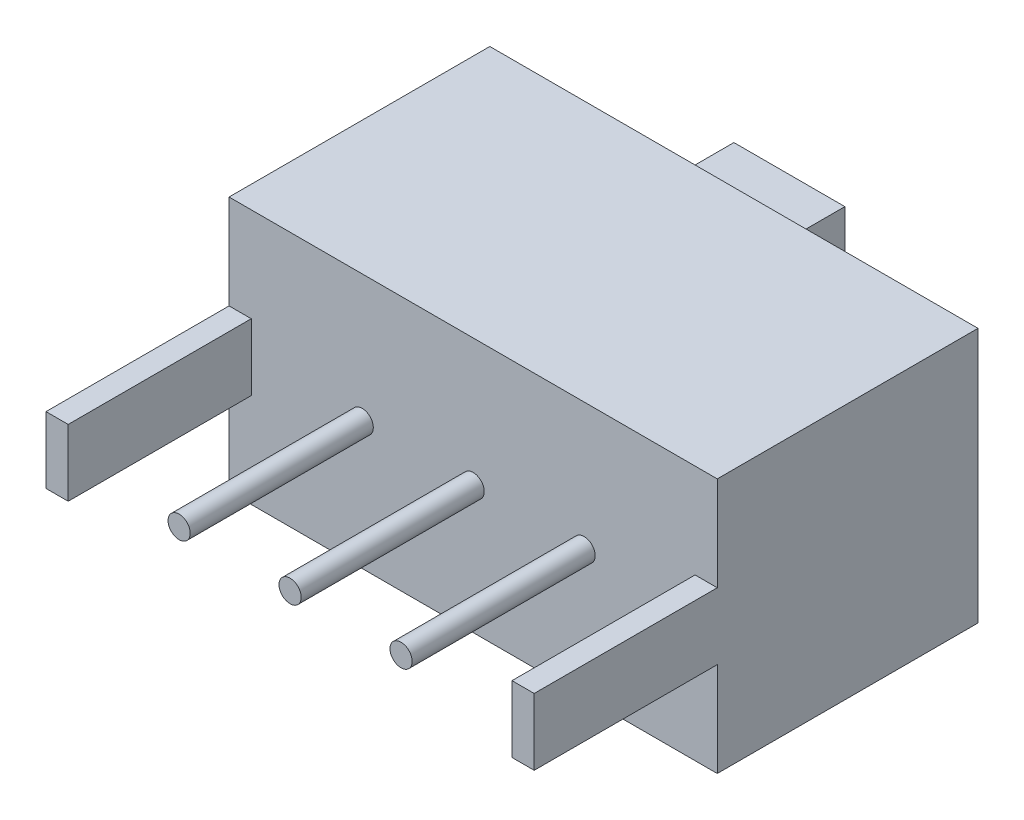
ISO-10303-21;
HEADER;
FILE_DESCRIPTION(('STEP AP214'),'2;1');
FILE_NAME('part.step','',(''),(''),'','','');
FILE_SCHEMA(('AUTOMOTIVE_DESIGN { 1 0 10303 214 1 1 1 1 }'));
ENDSEC;
DATA;
#1=APPLICATION_CONTEXT('core data for automotive mechanical design processes');
#2=APPLICATION_PROTOCOL_DEFINITION('international standard','automotive_design',2000,#1);
#3=PRODUCT_CONTEXT('',#1,'mechanical');
#4=PRODUCT('Part','Part','',(#3));
#5=PRODUCT_RELATED_PRODUCT_CATEGORY('part','',(#4));
#6=PRODUCT_DEFINITION_FORMATION('','',#4);
#7=PRODUCT_DEFINITION_CONTEXT('part definition',#1,'design');
#8=PRODUCT_DEFINITION('design','',#6,#7);
#9=PRODUCT_DEFINITION_SHAPE('','',#8);
#10=(LENGTH_UNIT() NAMED_UNIT(*) SI_UNIT(.MILLI.,.METRE.));
#11=(NAMED_UNIT(*) PLANE_ANGLE_UNIT() SI_UNIT($,.RADIAN.));
#12=(NAMED_UNIT(*) SI_UNIT($,.STERADIAN.) SOLID_ANGLE_UNIT());
#13=UNCERTAINTY_MEASURE_WITH_UNIT(LENGTH_MEASURE(1.E-05),#10,'distance_accuracy_value','');
#14=(GEOMETRIC_REPRESENTATION_CONTEXT(3) GLOBAL_UNCERTAINTY_ASSIGNED_CONTEXT((#13)) GLOBAL_UNIT_ASSIGNED_CONTEXT((#10,
#11,#12)) REPRESENTATION_CONTEXT('',''));
#15=CARTESIAN_POINT('',(0.,0.,0.));
#16=DIRECTION('',(0.,0.,1.));
#17=DIRECTION('',(1.,0.,0.));
#18=AXIS2_PLACEMENT_3D('',#15,#16,#17);
#19=CARTESIAN_POINT('',(0.,0.,4.7));
#20=DIRECTION('',(0.,0.,-1.));
#21=DIRECTION('',(-1.,0.,0.));
#22=AXIS2_PLACEMENT_3D('',#19,#20,#21);
#23=PLANE('',#22);
#24=CARTESIAN_POINT('',(2.4,-2.3,4.7));
#25=DIRECTION('',(0.,0.,-1.));
#26=DIRECTION('',(-1.,0.,0.));
#27=AXIS2_PLACEMENT_3D('',#24,#25,#26);
#28=CIRCLE('',#27,0.2);
#29=CARTESIAN_POINT('',(2.2,-2.3,4.7));
#30=VERTEX_POINT('',#29);
#31=EDGE_CURVE('E246',#30,#30,#28,.F.);
#32=ORIENTED_EDGE('',*,*,#31,.F.);
#33=EDGE_LOOP('',(#32));
#34=FACE_BOUND('',#33,.T.);
#35=CARTESIAN_POINT('',(4.4,-2.3,4.7));
#36=DIRECTION('',(0.,0.,-1.));
#37=DIRECTION('',(-1.,0.,0.));
#38=AXIS2_PLACEMENT_3D('',#35,#36,#37);
#39=CIRCLE('',#38,0.2);
#40=CARTESIAN_POINT('',(4.2,-2.3,4.7));
#41=VERTEX_POINT('',#40);
#42=EDGE_CURVE('E68',#41,#41,#39,.F.);
#43=ORIENTED_EDGE('',*,*,#42,.F.);
#44=EDGE_LOOP('',(#43));
#45=FACE_BOUND('',#44,.T.);
#46=CARTESIAN_POINT('',(6.4,-2.3,4.7));
#47=DIRECTION('',(0.,0.,-1.));
#48=DIRECTION('',(-1.,0.,0.));
#49=AXIS2_PLACEMENT_3D('',#46,#47,#48);
#50=CIRCLE('',#49,0.2);
#51=CARTESIAN_POINT('',(6.2,-2.3,4.7));
#52=VERTEX_POINT('',#51);
#53=EDGE_CURVE('E12',#52,#52,#50,.F.);
#54=ORIENTED_EDGE('',*,*,#53,.F.);
#55=EDGE_LOOP('',(#54));
#56=FACE_BOUND('',#55,.T.);
#57=DIRECTION('',(-1.,0.,0.));
#58=VECTOR('',#57,1.);
#59=CARTESIAN_POINT('',(8.8,-1.7,4.7));
#60=LINE('',#59,#58);
#61=CARTESIAN_POINT('',(8.8,-1.7,4.7));
#62=VERTEX_POINT('',#61);
#63=CARTESIAN_POINT('',(8.4,-1.7,4.7));
#64=VERTEX_POINT('',#63);
#65=EDGE_CURVE('E202',#62,#64,#60,.T.);
#66=ORIENTED_EDGE('',*,*,#65,.F.);
#67=DIRECTION('',(0.,-1.,0.));
#68=VECTOR('',#67,1.);
#69=CARTESIAN_POINT('',(8.8,0.,4.7));
#70=LINE('',#69,#68);
#71=CARTESIAN_POINT('',(8.8,0.,4.7));
#72=VERTEX_POINT('',#71);
#73=EDGE_CURVE('E212',#72,#62,#70,.T.);
#74=ORIENTED_EDGE('',*,*,#73,.F.);
#75=DIRECTION('',(1.,0.,0.));
#76=VECTOR('',#75,1.);
#77=CARTESIAN_POINT('',(0.,0.,4.7));
#78=LINE('',#77,#76);
#79=CARTESIAN_POINT('',(0.,0.,4.7));
#80=VERTEX_POINT('',#79);
#81=EDGE_CURVE('E226',#80,#72,#78,.T.);
#82=ORIENTED_EDGE('',*,*,#81,.F.);
#83=DIRECTION('',(0.,-1.,0.));
#84=VECTOR('',#83,1.);
#85=CARTESIAN_POINT('',(0.,0.,4.7));
#86=LINE('',#85,#84);
#87=CARTESIAN_POINT('',(0.,-1.7,4.7));
#88=VERTEX_POINT('',#87);
#89=EDGE_CURVE('E230',#80,#88,#86,.T.);
#90=ORIENTED_EDGE('',*,*,#89,.T.);
#91=DIRECTION('',(1.,0.,0.));
#92=VECTOR('',#91,1.);
#93=CARTESIAN_POINT('',(0.,-1.7,4.7));
#94=LINE('',#93,#92);
#95=CARTESIAN_POINT('',(0.4,-1.7,4.7));
#96=VERTEX_POINT('',#95);
#97=EDGE_CURVE('E83',#88,#96,#94,.T.);
#98=ORIENTED_EDGE('',*,*,#97,.T.);
#99=DIRECTION('',(0.,-1.,0.));
#100=VECTOR('',#99,1.);
#101=CARTESIAN_POINT('',(0.4,-1.7,4.7));
#102=LINE('',#101,#100);
#103=CARTESIAN_POINT('',(0.4,-2.9,4.7));
#104=VERTEX_POINT('',#103);
#105=EDGE_CURVE('E523',#96,#104,#102,.T.);
#106=ORIENTED_EDGE('',*,*,#105,.T.);
#107=DIRECTION('',(1.,0.,0.));
#108=VECTOR('',#107,1.);
#109=CARTESIAN_POINT('',(0.,-2.9,4.7));
#110=LINE('',#109,#108);
#111=CARTESIAN_POINT('',(0.,-2.9,4.7));
#112=VERTEX_POINT('',#111);
#113=EDGE_CURVE('E508',#112,#104,#110,.T.);
#114=ORIENTED_EDGE('',*,*,#113,.F.);
#115=CARTESIAN_POINT('',(0.,-4.6,4.7));
#116=VERTEX_POINT('',#115);
#117=EDGE_CURVE('E224',#112,#116,#86,.T.);
#118=ORIENTED_EDGE('',*,*,#117,.T.);
#119=DIRECTION('',(1.,0.,0.));
#120=VECTOR('',#119,1.);
#121=CARTESIAN_POINT('',(0.,-4.6,4.7));
#122=LINE('',#121,#120);
#123=CARTESIAN_POINT('',(8.8,-4.6,4.7));
#124=VERTEX_POINT('',#123);
#125=EDGE_CURVE('E220',#116,#124,#122,.T.);
#126=ORIENTED_EDGE('',*,*,#125,.T.);
#127=CARTESIAN_POINT('',(8.8,-2.9,4.7));
#128=VERTEX_POINT('',#127);
#129=EDGE_CURVE('E221',#128,#124,#70,.T.);
#130=ORIENTED_EDGE('',*,*,#129,.F.);
#131=DIRECTION('',(-1.,0.,0.));
#132=VECTOR('',#131,1.);
#133=CARTESIAN_POINT('',(8.8,-2.9,4.7));
#134=LINE('',#133,#132);
#135=CARTESIAN_POINT('',(8.4,-2.9,4.7));
#136=VERTEX_POINT('',#135);
#137=EDGE_CURVE('E502',#128,#136,#134,.T.);
#138=ORIENTED_EDGE('',*,*,#137,.T.);
#139=DIRECTION('',(0.,-1.,0.));
#140=VECTOR('',#139,1.);
#141=CARTESIAN_POINT('',(8.4,-1.7,4.7));
#142=LINE('',#141,#140);
#143=EDGE_CURVE('E75',#64,#136,#142,.T.);
#144=ORIENTED_EDGE('',*,*,#143,.F.);
#145=EDGE_LOOP('',(#66,#74,#82,#90,#98,#106,#114,#118,#126,#130,#138,#144));
#146=FACE_BOUND('',#145,.T.);
#147=ADVANCED_FACE('F60',(#34,#45,#56,#146),#23,.F.);
#148=CARTESIAN_POINT('',(0.,0.,0.));
#149=DIRECTION('',(0.,0.,-1.));
#150=DIRECTION('',(-1.,0.,0.));
#151=AXIS2_PLACEMENT_3D('',#148,#149,#150);
#152=PLANE('',#151);
#153=DIRECTION('',(1.,0.,0.));
#154=VECTOR('',#153,1.);
#155=CARTESIAN_POINT('',(0.,0.,0.));
#156=LINE('',#155,#154);
#157=CARTESIAN_POINT('',(0.,0.,0.));
#158=VERTEX_POINT('',#157);
#159=CARTESIAN_POINT('',(8.8,0.,0.));
#160=VERTEX_POINT('',#159);
#161=EDGE_CURVE('E232',#158,#160,#156,.T.);
#162=ORIENTED_EDGE('',*,*,#161,.T.);
#163=DIRECTION('',(0.,-1.,0.));
#164=VECTOR('',#163,1.);
#165=CARTESIAN_POINT('',(8.8,0.,0.));
#166=LINE('',#165,#164);
#167=CARTESIAN_POINT('',(8.8,-4.6,0.));
#168=VERTEX_POINT('',#167);
#169=EDGE_CURVE('E235',#160,#168,#166,.T.);
#170=ORIENTED_EDGE('',*,*,#169,.T.);
#171=DIRECTION('',(1.,0.,0.));
#172=VECTOR('',#171,1.);
#173=CARTESIAN_POINT('',(0.,-4.6,0.));
#174=LINE('',#173,#172);
#175=CARTESIAN_POINT('',(0.,-4.6,0.));
#176=VERTEX_POINT('',#175);
#177=EDGE_CURVE('E239',#176,#168,#174,.T.);
#178=ORIENTED_EDGE('',*,*,#177,.F.);
#179=DIRECTION('',(0.,-1.,0.));
#180=VECTOR('',#179,1.);
#181=CARTESIAN_POINT('',(0.,0.,0.));
#182=LINE('',#181,#180);
#183=EDGE_CURVE('E242',#158,#176,#182,.T.);
#184=ORIENTED_EDGE('',*,*,#183,.F.);
#185=EDGE_LOOP('',(#162,#170,#178,#184));
#186=FACE_BOUND('',#185,.T.);
#187=DIRECTION('',(1.,0.,0.));
#188=VECTOR('',#187,1.);
#189=CARTESIAN_POINT('',(2.3,-1.2,0.));
#190=LINE('',#189,#188);
#191=CARTESIAN_POINT('',(2.3,-1.2,0.));
#192=VERTEX_POINT('',#191);
#193=CARTESIAN_POINT('',(6.5,-1.2,0.));
#194=VERTEX_POINT('',#193);
#195=EDGE_CURVE('E572',#192,#194,#190,.T.);
#196=ORIENTED_EDGE('',*,*,#195,.F.);
#197=DIRECTION('',(0.,-1.,0.));
#198=VECTOR('',#197,1.);
#199=CARTESIAN_POINT('',(2.3,-1.2,0.));
#200=LINE('',#199,#198);
#201=CARTESIAN_POINT('',(2.3,-3.4,0.));
#202=VERTEX_POINT('',#201);
#203=EDGE_CURVE('E562',#192,#202,#200,.T.);
#204=ORIENTED_EDGE('',*,*,#203,.T.);
#205=DIRECTION('',(1.,0.,0.));
#206=VECTOR('',#205,1.);
#207=CARTESIAN_POINT('',(2.3,-3.4,0.));
#208=LINE('',#207,#206);
#209=CARTESIAN_POINT('',(6.5,-3.4,0.));
#210=VERTEX_POINT('',#209);
#211=EDGE_CURVE('E583',#202,#210,#208,.T.);
#212=ORIENTED_EDGE('',*,*,#211,.T.);
#213=DIRECTION('',(0.,-1.,0.));
#214=VECTOR('',#213,1.);
#215=CARTESIAN_POINT('',(6.5,-1.2,0.));
#216=LINE('',#215,#214);
#217=EDGE_CURVE('E586',#194,#210,#216,.T.);
#218=ORIENTED_EDGE('',*,*,#217,.F.);
#219=EDGE_LOOP('',(#196,#204,#212,#218));
#220=FACE_BOUND('',#219,.T.);
#221=ADVANCED_FACE('F261',(#186,#220),#152,.T.);
#222=CARTESIAN_POINT('',(0.,0.,4.7));
#223=DIRECTION('',(0.,1.,0.));
#224=DIRECTION('',(0.,0.,1.));
#225=AXIS2_PLACEMENT_3D('',#222,#223,#224);
#226=PLANE('',#225);
#227=ORIENTED_EDGE('',*,*,#161,.F.);
#228=DIRECTION('',(0.,0.,-1.));
#229=VECTOR('',#228,1.);
#230=CARTESIAN_POINT('',(0.,0.,4.7));
#231=LINE('',#230,#229);
#232=EDGE_CURVE('E244',#80,#158,#231,.T.);
#233=ORIENTED_EDGE('',*,*,#232,.F.);
#234=ORIENTED_EDGE('',*,*,#81,.T.);
#235=DIRECTION('',(0.,0.,-1.));
#236=VECTOR('',#235,1.);
#237=CARTESIAN_POINT('',(8.8,0.,4.7));
#238=LINE('',#237,#236);
#239=EDGE_CURVE('E219',#72,#160,#238,.T.);
#240=ORIENTED_EDGE('',*,*,#239,.T.);
#241=EDGE_LOOP('',(#227,#233,#234,#240));
#242=FACE_BOUND('',#241,.T.);
#243=ADVANCED_FACE('F62',(#242),#226,.T.);
#244=CARTESIAN_POINT('',(0.,0.,4.7));
#245=DIRECTION('',(1.,0.,0.));
#246=DIRECTION('',(0.,1.,0.));
#247=AXIS2_PLACEMENT_3D('',#244,#245,#246);
#248=PLANE('',#247);
#249=ORIENTED_EDGE('',*,*,#183,.T.);
#250=DIRECTION('',(0.,0.,-1.));
#251=VECTOR('',#250,1.);
#252=CARTESIAN_POINT('',(0.,-4.6,4.7));
#253=LINE('',#252,#251);
#254=EDGE_CURVE('E247',#116,#176,#253,.T.);
#255=ORIENTED_EDGE('',*,*,#254,.F.);
#256=ORIENTED_EDGE('',*,*,#117,.F.);
#257=DIRECTION('',(0.,0.,-1.));
#258=VECTOR('',#257,1.);
#259=CARTESIAN_POINT('',(0.,-2.9,8.));
#260=LINE('',#259,#258);
#261=CARTESIAN_POINT('',(0.,-2.9,8.));
#262=VERTEX_POINT('',#261);
#263=EDGE_CURVE('E533',#262,#112,#260,.T.);
#264=ORIENTED_EDGE('',*,*,#263,.F.);
#265=DIRECTION('',(0.,-1.,0.));
#266=VECTOR('',#265,1.);
#267=CARTESIAN_POINT('',(0.,-1.7,8.));
#268=LINE('',#267,#266);
#269=CARTESIAN_POINT('',(0.,-1.7,8.));
#270=VERTEX_POINT('',#269);
#271=EDGE_CURVE('E509',#270,#262,#268,.T.);
#272=ORIENTED_EDGE('',*,*,#271,.F.);
#273=DIRECTION('',(0.,0.,-1.));
#274=VECTOR('',#273,1.);
#275=CARTESIAN_POINT('',(0.,-1.7,8.));
#276=LINE('',#275,#274);
#277=EDGE_CURVE('E520',#270,#88,#276,.T.);
#278=ORIENTED_EDGE('',*,*,#277,.T.);
#279=ORIENTED_EDGE('',*,*,#89,.F.);
#280=ORIENTED_EDGE('',*,*,#232,.T.);
#281=EDGE_LOOP('',(#249,#255,#256,#264,#272,#278,#279,#280));
#282=FACE_BOUND('',#281,.T.);
#283=ADVANCED_FACE('F355',(#282),#248,.F.);
#284=CARTESIAN_POINT('',(0.,-4.6,4.7));
#285=DIRECTION('',(0.,1.,0.));
#286=DIRECTION('',(0.,0.,1.));
#287=AXIS2_PLACEMENT_3D('',#284,#285,#286);
#288=PLANE('',#287);
#289=ORIENTED_EDGE('',*,*,#177,.T.);
#290=DIRECTION('',(0.,0.,-1.));
#291=VECTOR('',#290,1.);
#292=CARTESIAN_POINT('',(8.8,-4.6,4.7));
#293=LINE('',#292,#291);
#294=EDGE_CURVE('E250',#124,#168,#293,.T.);
#295=ORIENTED_EDGE('',*,*,#294,.F.);
#296=ORIENTED_EDGE('',*,*,#125,.F.);
#297=ORIENTED_EDGE('',*,*,#254,.T.);
#298=EDGE_LOOP('',(#289,#295,#296,#297));
#299=FACE_BOUND('',#298,.T.);
#300=ADVANCED_FACE('F358',(#299),#288,.F.);
#301=CARTESIAN_POINT('',(8.8,0.,4.7));
#302=DIRECTION('',(1.,0.,0.));
#303=DIRECTION('',(0.,0.,-1.));
#304=AXIS2_PLACEMENT_3D('',#301,#302,#303);
#305=PLANE('',#304);
#306=ORIENTED_EDGE('',*,*,#169,.F.);
#307=ORIENTED_EDGE('',*,*,#239,.F.);
#308=ORIENTED_EDGE('',*,*,#73,.T.);
#309=DIRECTION('',(0.,0.,-1.));
#310=VECTOR('',#309,1.);
#311=CARTESIAN_POINT('',(8.8,-1.7,8.));
#312=LINE('',#311,#310);
#313=CARTESIAN_POINT('',(8.8,-1.7,8.));
#314=VERTEX_POINT('',#313);
#315=EDGE_CURVE('E198',#314,#62,#312,.T.);
#316=ORIENTED_EDGE('',*,*,#315,.F.);
#317=DIRECTION('',(0.,-1.,0.));
#318=VECTOR('',#317,1.);
#319=CARTESIAN_POINT('',(8.8,-1.7,8.));
#320=LINE('',#319,#318);
#321=CARTESIAN_POINT('',(8.8,-2.9,8.));
#322=VERTEX_POINT('',#321);
#323=EDGE_CURVE('E215',#314,#322,#320,.T.);
#324=ORIENTED_EDGE('',*,*,#323,.T.);
#325=DIRECTION('',(0.,0.,-1.));
#326=VECTOR('',#325,1.);
#327=CARTESIAN_POINT('',(8.8,-2.9,8.));
#328=LINE('',#327,#326);
#329=EDGE_CURVE('E631',#322,#128,#328,.T.);
#330=ORIENTED_EDGE('',*,*,#329,.T.);
#331=ORIENTED_EDGE('',*,*,#129,.T.);
#332=ORIENTED_EDGE('',*,*,#294,.T.);
#333=EDGE_LOOP('',(#306,#307,#308,#316,#324,#330,#331,#332));
#334=FACE_BOUND('',#333,.T.);
#335=ADVANCED_FACE('F218',(#334),#305,.T.);
#336=CARTESIAN_POINT('',(2.3,-1.2,0.2));
#337=DIRECTION('',(1.,0.,0.));
#338=DIRECTION('',(0.,0.,-1.));
#339=AXIS2_PLACEMENT_3D('',#336,#337,#338);
#340=PLANE('',#339);
#341=ORIENTED_EDGE('',*,*,#203,.F.);
#342=DIRECTION('',(0.,0.,-1.));
#343=VECTOR('',#342,1.);
#344=CARTESIAN_POINT('',(2.3,-1.2,0.2));
#345=LINE('',#344,#343);
#346=CARTESIAN_POINT('',(2.3,-1.2,0.2));
#347=VERTEX_POINT('',#346);
#348=EDGE_CURVE('E580',#347,#192,#345,.T.);
#349=ORIENTED_EDGE('',*,*,#348,.F.);
#350=DIRECTION('',(0.,-1.,0.));
#351=VECTOR('',#350,1.);
#352=CARTESIAN_POINT('',(2.3,-1.2,0.2));
#353=LINE('',#352,#351);
#354=CARTESIAN_POINT('',(2.3,-3.4,0.2));
#355=VERTEX_POINT('',#354);
#356=EDGE_CURVE('E568',#347,#355,#353,.T.);
#357=ORIENTED_EDGE('',*,*,#356,.T.);
#358=DIRECTION('',(0.,0.,-1.));
#359=VECTOR('',#358,1.);
#360=CARTESIAN_POINT('',(2.3,-3.4,0.2));
#361=LINE('',#360,#359);
#362=EDGE_CURVE('E236',#355,#202,#361,.T.);
#363=ORIENTED_EDGE('',*,*,#362,.T.);
#364=EDGE_LOOP('',(#341,#349,#357,#363));
#365=FACE_BOUND('',#364,.T.);
#366=ADVANCED_FACE('F347',(#365),#340,.T.);
#367=CARTESIAN_POINT('',(2.3,-3.4,0.2));
#368=DIRECTION('',(0.,1.,0.));
#369=DIRECTION('',(-1.,0.,0.));
#370=AXIS2_PLACEMENT_3D('',#367,#368,#369);
#371=PLANE('',#370);
#372=ORIENTED_EDGE('',*,*,#211,.F.);
#373=ORIENTED_EDGE('',*,*,#362,.F.);
#374=DIRECTION('',(1.,0.,0.));
#375=VECTOR('',#374,1.);
#376=CARTESIAN_POINT('',(2.3,-3.4,0.2));
#377=LINE('',#376,#375);
#378=CARTESIAN_POINT('',(6.5,-3.4,0.2));
#379=VERTEX_POINT('',#378);
#380=EDGE_CURVE('E571',#355,#379,#377,.T.);
#381=ORIENTED_EDGE('',*,*,#380,.T.);
#382=DIRECTION('',(0.,0.,-1.));
#383=VECTOR('',#382,1.);
#384=CARTESIAN_POINT('',(6.5,-3.4,0.2));
#385=LINE('',#384,#383);
#386=EDGE_CURVE('E595',#379,#210,#385,.T.);
#387=ORIENTED_EDGE('',*,*,#386,.T.);
#388=EDGE_LOOP('',(#372,#373,#381,#387));
#389=FACE_BOUND('',#388,.T.);
#390=ADVANCED_FACE('F343',(#389),#371,.T.);
#391=CARTESIAN_POINT('',(6.5,-1.2,0.2));
#392=DIRECTION('',(1.,0.,0.));
#393=DIRECTION('',(0.,0.,-1.));
#394=AXIS2_PLACEMENT_3D('',#391,#392,#393);
#395=PLANE('',#394);
#396=ORIENTED_EDGE('',*,*,#217,.T.);
#397=ORIENTED_EDGE('',*,*,#386,.F.);
#398=DIRECTION('',(0.,-1.,0.));
#399=VECTOR('',#398,1.);
#400=CARTESIAN_POINT('',(6.5,-1.2,0.2));
#401=LINE('',#400,#399);
#402=CARTESIAN_POINT('',(6.5,-1.2,0.2));
#403=VERTEX_POINT('',#402);
#404=EDGE_CURVE('E574',#403,#379,#401,.T.);
#405=ORIENTED_EDGE('',*,*,#404,.F.);
#406=DIRECTION('',(0.,0.,-1.));
#407=VECTOR('',#406,1.);
#408=CARTESIAN_POINT('',(6.5,-1.2,0.2));
#409=LINE('',#408,#407);
#410=EDGE_CURVE('E593',#403,#194,#409,.T.);
#411=ORIENTED_EDGE('',*,*,#410,.T.);
#412=EDGE_LOOP('',(#396,#397,#405,#411));
#413=FACE_BOUND('',#412,.T.);
#414=ADVANCED_FACE('F339',(#413),#395,.F.);
#415=CARTESIAN_POINT('',(2.3,-1.2,0.2));
#416=DIRECTION('',(0.,1.,0.));
#417=DIRECTION('',(-1.,0.,0.));
#418=AXIS2_PLACEMENT_3D('',#415,#416,#417);
#419=PLANE('',#418);
#420=ORIENTED_EDGE('',*,*,#195,.T.);
#421=ORIENTED_EDGE('',*,*,#410,.F.);
#422=DIRECTION('',(1.,0.,0.));
#423=VECTOR('',#422,1.);
#424=CARTESIAN_POINT('',(2.3,-1.2,0.2));
#425=LINE('',#424,#423);
#426=EDGE_CURVE('E577',#347,#403,#425,.T.);
#427=ORIENTED_EDGE('',*,*,#426,.F.);
#428=ORIENTED_EDGE('',*,*,#348,.T.);
#429=EDGE_LOOP('',(#420,#421,#427,#428));
#430=FACE_BOUND('',#429,.T.);
#431=ADVANCED_FACE('F335',(#430),#419,.F.);
#432=CARTESIAN_POINT('',(0.,0.,0.2));
#433=DIRECTION('',(0.,0.,1.));
#434=DIRECTION('',(1.,0.,0.));
#435=AXIS2_PLACEMENT_3D('',#432,#433,#434);
#436=PLANE('',#435);
#437=DIRECTION('',(1.,0.,0.));
#438=VECTOR('',#437,1.);
#439=CARTESIAN_POINT('',(2.4,-1.3,0.2));
#440=LINE('',#439,#438);
#441=CARTESIAN_POINT('',(2.4,-1.3,0.2));
#442=VERTEX_POINT('',#441);
#443=CARTESIAN_POINT('',(4.4,-1.3,0.2));
#444=VERTEX_POINT('',#443);
#445=EDGE_CURVE('E548',#442,#444,#440,.T.);
#446=ORIENTED_EDGE('',*,*,#445,.F.);
#447=DIRECTION('',(0.,-1.,0.));
#448=VECTOR('',#447,1.);
#449=CARTESIAN_POINT('',(2.4,-1.3,0.2));
#450=LINE('',#449,#448);
#451=CARTESIAN_POINT('',(2.4,-3.3,0.2));
#452=VERTEX_POINT('',#451);
#453=EDGE_CURVE('E557',#442,#452,#450,.T.);
#454=ORIENTED_EDGE('',*,*,#453,.T.);
#455=DIRECTION('',(1.,0.,0.));
#456=VECTOR('',#455,1.);
#457=CARTESIAN_POINT('',(2.4,-3.3,0.2));
#458=LINE('',#457,#456);
#459=CARTESIAN_POINT('',(4.4,-3.3,0.2));
#460=VERTEX_POINT('',#459);
#461=EDGE_CURVE('E554',#452,#460,#458,.T.);
#462=ORIENTED_EDGE('',*,*,#461,.T.);
#463=DIRECTION('',(0.,-1.,0.));
#464=VECTOR('',#463,1.);
#465=CARTESIAN_POINT('',(4.4,-1.3,0.2));
#466=LINE('',#465,#464);
#467=EDGE_CURVE('E551',#444,#460,#466,.T.);
#468=ORIENTED_EDGE('',*,*,#467,.F.);
#469=EDGE_LOOP('',(#446,#454,#462,#468));
#470=FACE_BOUND('',#469,.T.);
#471=ORIENTED_EDGE('',*,*,#356,.F.);
#472=ORIENTED_EDGE('',*,*,#426,.T.);
#473=ORIENTED_EDGE('',*,*,#404,.T.);
#474=ORIENTED_EDGE('',*,*,#380,.F.);
#475=EDGE_LOOP('',(#471,#472,#473,#474));
#476=FACE_BOUND('',#475,.T.);
#477=ADVANCED_FACE('F331',(#470,#476),#436,.F.);
#478=CARTESIAN_POINT('',(2.4,-1.3,0.2));
#479=DIRECTION('',(0.,1.,0.));
#480=DIRECTION('',(0.,0.,1.));
#481=AXIS2_PLACEMENT_3D('',#478,#479,#480);
#482=PLANE('',#481);
#483=DIRECTION('',(0.,0.,-1.));
#484=VECTOR('',#483,1.);
#485=CARTESIAN_POINT('',(4.4,-1.3,0.2));
#486=LINE('',#485,#484);
#487=CARTESIAN_POINT('',(4.4,-1.3,-2.));
#488=VERTEX_POINT('',#487);
#489=EDGE_CURVE('E559',#444,#488,#486,.T.);
#490=ORIENTED_EDGE('',*,*,#489,.T.);
#491=DIRECTION('',(1.,0.,0.));
#492=VECTOR('',#491,1.);
#493=CARTESIAN_POINT('',(2.4,-1.3,-2.));
#494=LINE('',#493,#492);
#495=CARTESIAN_POINT('',(2.4,-1.3,-2.));
#496=VERTEX_POINT('',#495);
#497=EDGE_CURVE('E536',#496,#488,#494,.T.);
#498=ORIENTED_EDGE('',*,*,#497,.F.);
#499=DIRECTION('',(0.,0.,-1.));
#500=VECTOR('',#499,1.);
#501=CARTESIAN_POINT('',(2.4,-1.3,0.2));
#502=LINE('',#501,#500);
#503=EDGE_CURVE('E560',#442,#496,#502,.T.);
#504=ORIENTED_EDGE('',*,*,#503,.F.);
#505=ORIENTED_EDGE('',*,*,#445,.T.);
#506=EDGE_LOOP('',(#490,#498,#504,#505));
#507=FACE_BOUND('',#506,.T.);
#508=ADVANCED_FACE('F321',(#507),#482,.T.);
#509=CARTESIAN_POINT('',(2.4,-1.3,0.2));
#510=DIRECTION('',(1.,0.,0.));
#511=DIRECTION('',(0.,0.,-1.));
#512=AXIS2_PLACEMENT_3D('',#509,#510,#511);
#513=PLANE('',#512);
#514=ORIENTED_EDGE('',*,*,#503,.T.);
#515=DIRECTION('',(0.,-1.,0.));
#516=VECTOR('',#515,1.);
#517=CARTESIAN_POINT('',(2.4,-1.3,-2.));
#518=LINE('',#517,#516);
#519=CARTESIAN_POINT('',(2.4,-3.3,-2.));
#520=VERTEX_POINT('',#519);
#521=EDGE_CURVE('E545',#496,#520,#518,.T.);
#522=ORIENTED_EDGE('',*,*,#521,.T.);
#523=DIRECTION('',(0.,0.,-1.));
#524=VECTOR('',#523,1.);
#525=CARTESIAN_POINT('',(2.4,-3.3,0.2));
#526=LINE('',#525,#524);
#527=EDGE_CURVE('E563',#452,#520,#526,.T.);
#528=ORIENTED_EDGE('',*,*,#527,.F.);
#529=ORIENTED_EDGE('',*,*,#453,.F.);
#530=EDGE_LOOP('',(#514,#522,#528,#529));
#531=FACE_BOUND('',#530,.T.);
#532=ADVANCED_FACE('F317',(#531),#513,.F.);
#533=CARTESIAN_POINT('',(2.4,-3.3,0.2));
#534=DIRECTION('',(0.,1.,0.));
#535=DIRECTION('',(0.,0.,1.));
#536=AXIS2_PLACEMENT_3D('',#533,#534,#535);
#537=PLANE('',#536);
#538=ORIENTED_EDGE('',*,*,#527,.T.);
#539=DIRECTION('',(1.,0.,0.));
#540=VECTOR('',#539,1.);
#541=CARTESIAN_POINT('',(2.4,-3.3,-2.));
#542=LINE('',#541,#540);
#543=CARTESIAN_POINT('',(4.4,-3.3,-2.));
#544=VERTEX_POINT('',#543);
#545=EDGE_CURVE('E542',#520,#544,#542,.T.);
#546=ORIENTED_EDGE('',*,*,#545,.T.);
#547=DIRECTION('',(0.,0.,-1.));
#548=VECTOR('',#547,1.);
#549=CARTESIAN_POINT('',(4.4,-3.3,0.2));
#550=LINE('',#549,#548);
#551=EDGE_CURVE('E565',#460,#544,#550,.T.);
#552=ORIENTED_EDGE('',*,*,#551,.F.);
#553=ORIENTED_EDGE('',*,*,#461,.F.);
#554=EDGE_LOOP('',(#538,#546,#552,#553));
#555=FACE_BOUND('',#554,.T.);
#556=ADVANCED_FACE('F320',(#555),#537,.F.);
#557=CARTESIAN_POINT('',(4.4,-1.3,0.2));
#558=DIRECTION('',(1.,0.,0.));
#559=DIRECTION('',(0.,0.,-1.));
#560=AXIS2_PLACEMENT_3D('',#557,#558,#559);
#561=PLANE('',#560);
#562=ORIENTED_EDGE('',*,*,#551,.T.);
#563=DIRECTION('',(0.,-1.,0.));
#564=VECTOR('',#563,1.);
#565=CARTESIAN_POINT('',(4.4,-1.3,-2.));
#566=LINE('',#565,#564);
#567=EDGE_CURVE('E539',#488,#544,#566,.T.);
#568=ORIENTED_EDGE('',*,*,#567,.F.);
#569=ORIENTED_EDGE('',*,*,#489,.F.);
#570=ORIENTED_EDGE('',*,*,#467,.T.);
#571=EDGE_LOOP('',(#562,#568,#569,#570));
#572=FACE_BOUND('',#571,.T.);
#573=ADVANCED_FACE('F315',(#572),#561,.T.);
#574=CARTESIAN_POINT('',(0.,0.,-2.));
#575=DIRECTION('',(0.,0.,-1.));
#576=DIRECTION('',(-1.,0.,0.));
#577=AXIS2_PLACEMENT_3D('',#574,#575,#576);
#578=PLANE('',#577);
#579=ORIENTED_EDGE('',*,*,#497,.T.);
#580=ORIENTED_EDGE('',*,*,#567,.T.);
#581=ORIENTED_EDGE('',*,*,#545,.F.);
#582=ORIENTED_EDGE('',*,*,#521,.F.);
#583=EDGE_LOOP('',(#579,#580,#581,#582));
#584=FACE_BOUND('',#583,.T.);
#585=ADVANCED_FACE('F311',(#584),#578,.T.);
#586=CARTESIAN_POINT('',(0.,-2.9,8.));
#587=DIRECTION('',(0.,1.,0.));
#588=DIRECTION('',(0.,0.,1.));
#589=AXIS2_PLACEMENT_3D('',#586,#587,#588);
#590=PLANE('',#589);
#591=ORIENTED_EDGE('',*,*,#113,.T.);
#592=DIRECTION('',(0.,0.,-1.));
#593=VECTOR('',#592,1.);
#594=CARTESIAN_POINT('',(0.4,-2.9,8.));
#595=LINE('',#594,#593);
#596=CARTESIAN_POINT('',(0.4,-2.9,8.));
#597=VERTEX_POINT('',#596);
#598=EDGE_CURVE('E530',#597,#104,#595,.T.);
#599=ORIENTED_EDGE('',*,*,#598,.F.);
#600=DIRECTION('',(1.,0.,0.));
#601=VECTOR('',#600,1.);
#602=CARTESIAN_POINT('',(0.,-2.9,8.));
#603=LINE('',#602,#601);
#604=EDGE_CURVE('E512',#262,#597,#603,.T.);
#605=ORIENTED_EDGE('',*,*,#604,.F.);
#606=ORIENTED_EDGE('',*,*,#263,.T.);
#607=EDGE_LOOP('',(#591,#599,#605,#606));
#608=FACE_BOUND('',#607,.T.);
#609=ADVANCED_FACE('F307',(#608),#590,.F.);
#610=CARTESIAN_POINT('',(0.4,-1.7,8.));
#611=DIRECTION('',(1.,0.,0.));
#612=DIRECTION('',(0.,0.,-1.));
#613=AXIS2_PLACEMENT_3D('',#610,#611,#612);
#614=PLANE('',#613);
#615=ORIENTED_EDGE('',*,*,#105,.F.);
#616=DIRECTION('',(0.,0.,-1.));
#617=VECTOR('',#616,1.);
#618=CARTESIAN_POINT('',(0.4,-1.7,8.));
#619=LINE('',#618,#617);
#620=CARTESIAN_POINT('',(0.4,-1.7,8.));
#621=VERTEX_POINT('',#620);
#622=EDGE_CURVE('E528',#621,#96,#619,.T.);
#623=ORIENTED_EDGE('',*,*,#622,.F.);
#624=DIRECTION('',(0.,-1.,0.));
#625=VECTOR('',#624,1.);
#626=CARTESIAN_POINT('',(0.4,-1.7,8.));
#627=LINE('',#626,#625);
#628=EDGE_CURVE('E514',#621,#597,#627,.T.);
#629=ORIENTED_EDGE('',*,*,#628,.T.);
#630=ORIENTED_EDGE('',*,*,#598,.T.);
#631=EDGE_LOOP('',(#615,#623,#629,#630));
#632=FACE_BOUND('',#631,.T.);
#633=ADVANCED_FACE('F303',(#632),#614,.T.);
#634=CARTESIAN_POINT('',(0.,-1.7,8.));
#635=DIRECTION('',(0.,1.,0.));
#636=DIRECTION('',(-1.,0.,0.));
#637=AXIS2_PLACEMENT_3D('',#634,#635,#636);
#638=PLANE('',#637);
#639=ORIENTED_EDGE('',*,*,#97,.F.);
#640=ORIENTED_EDGE('',*,*,#277,.F.);
#641=DIRECTION('',(1.,0.,0.));
#642=VECTOR('',#641,1.);
#643=CARTESIAN_POINT('',(0.,-1.7,8.));
#644=LINE('',#643,#642);
#645=EDGE_CURVE('E517',#270,#621,#644,.T.);
#646=ORIENTED_EDGE('',*,*,#645,.T.);
#647=ORIENTED_EDGE('',*,*,#622,.T.);
#648=EDGE_LOOP('',(#639,#640,#646,#647));
#649=FACE_BOUND('',#648,.T.);
#650=ADVANCED_FACE('F299',(#649),#638,.T.);
#651=CARTESIAN_POINT('',(0.,0.,8.));
#652=DIRECTION('',(0.,0.,1.));
#653=DIRECTION('',(1.,0.,0.));
#654=AXIS2_PLACEMENT_3D('',#651,#652,#653);
#655=PLANE('',#654);
#656=ORIENTED_EDGE('',*,*,#271,.T.);
#657=ORIENTED_EDGE('',*,*,#604,.T.);
#658=ORIENTED_EDGE('',*,*,#628,.F.);
#659=ORIENTED_EDGE('',*,*,#645,.F.);
#660=EDGE_LOOP('',(#656,#657,#658,#659));
#661=FACE_BOUND('',#660,.T.);
#662=ADVANCED_FACE('F292',(#661),#655,.T.);
#663=CARTESIAN_POINT('',(2.4,-2.3,8.));
#664=DIRECTION('',(0.,0.,-1.));
#665=DIRECTION('',(-1.,0.,0.));
#666=AXIS2_PLACEMENT_3D('',#663,#664,#665);
#667=CYLINDRICAL_SURFACE('',#666,0.2);
#668=CARTESIAN_POINT('',(2.4,-2.3,8.));
#669=DIRECTION('',(0.,0.,1.));
#670=DIRECTION('',(1.,0.,0.));
#671=AXIS2_PLACEMENT_3D('',#668,#669,#670);
#672=CIRCLE('',#671,0.2);
#673=CARTESIAN_POINT('',(2.6,-2.3,8.));
#674=VERTEX_POINT('',#673);
#675=EDGE_CURVE('E505',#674,#674,#672,.T.);
#676=ORIENTED_EDGE('',*,*,#675,.F.);
#677=EDGE_LOOP('',(#676));
#678=FACE_BOUND('',#677,.T.);
#679=ORIENTED_EDGE('',*,*,#31,.T.);
#680=EDGE_LOOP('',(#679));
#681=FACE_BOUND('',#680,.T.);
#682=ADVANCED_FACE('F289',(#678,#681),#667,.T.);
#683=CARTESIAN_POINT('',(2.4,-2.3,8.));
#684=DIRECTION('',(0.,0.,1.));
#685=DIRECTION('',(1.,0.,0.));
#686=AXIS2_PLACEMENT_3D('',#683,#684,#685);
#687=PLANE('',#686);
#688=ORIENTED_EDGE('',*,*,#675,.T.);
#689=EDGE_LOOP('',(#688));
#690=FACE_BOUND('',#689,.T.);
#691=ADVANCED_FACE('F286',(#690),#687,.T.);
#692=CARTESIAN_POINT('',(4.4,-2.3,8.));
#693=DIRECTION('',(0.,0.,-1.));
#694=DIRECTION('',(-1.,0.,0.));
#695=AXIS2_PLACEMENT_3D('',#692,#693,#694);
#696=CYLINDRICAL_SURFACE('',#695,0.2);
#697=CARTESIAN_POINT('',(4.4,-2.3,8.));
#698=DIRECTION('',(0.,0.,1.));
#699=DIRECTION('',(1.,0.,0.));
#700=AXIS2_PLACEMENT_3D('',#697,#698,#699);
#701=CIRCLE('',#700,0.2);
#702=CARTESIAN_POINT('',(4.6,-2.3,8.));
#703=VERTEX_POINT('',#702);
#704=EDGE_CURVE('E501',#703,#703,#701,.T.);
#705=ORIENTED_EDGE('',*,*,#704,.F.);
#706=EDGE_LOOP('',(#705));
#707=FACE_BOUND('',#706,.T.);
#708=ORIENTED_EDGE('',*,*,#42,.T.);
#709=EDGE_LOOP('',(#708));
#710=FACE_BOUND('',#709,.T.);
#711=ADVANCED_FACE('F257',(#707,#710),#696,.T.);
#712=CARTESIAN_POINT('',(4.4,-2.3,8.));
#713=DIRECTION('',(0.,0.,1.));
#714=DIRECTION('',(1.,0.,0.));
#715=AXIS2_PLACEMENT_3D('',#712,#713,#714);
#716=PLANE('',#715);
#717=ORIENTED_EDGE('',*,*,#704,.T.);
#718=EDGE_LOOP('',(#717));
#719=FACE_BOUND('',#718,.T.);
#720=ADVANCED_FACE('F269',(#719),#716,.T.);
#721=CARTESIAN_POINT('',(6.4,-2.3,8.));
#722=DIRECTION('',(0.,0.,-1.));
#723=DIRECTION('',(-1.,0.,0.));
#724=AXIS2_PLACEMENT_3D('',#721,#722,#723);
#725=CYLINDRICAL_SURFACE('',#724,0.2);
#726=CARTESIAN_POINT('',(6.4,-2.3,8.));
#727=DIRECTION('',(0.,0.,1.));
#728=DIRECTION('',(1.,0.,0.));
#729=AXIS2_PLACEMENT_3D('',#726,#727,#728);
#730=CIRCLE('',#729,0.2);
#731=CARTESIAN_POINT('',(6.6,-2.3,8.));
#732=VERTEX_POINT('',#731);
#733=EDGE_CURVE('E498',#732,#732,#730,.T.);
#734=ORIENTED_EDGE('',*,*,#733,.F.);
#735=EDGE_LOOP('',(#734));
#736=FACE_BOUND('',#735,.T.);
#737=ORIENTED_EDGE('',*,*,#53,.T.);
#738=EDGE_LOOP('',(#737));
#739=FACE_BOUND('',#738,.T.);
#740=ADVANCED_FACE('F266',(#736,#739),#725,.T.);
#741=CARTESIAN_POINT('',(6.4,-2.3,8.));
#742=DIRECTION('',(0.,0.,1.));
#743=DIRECTION('',(1.,0.,0.));
#744=AXIS2_PLACEMENT_3D('',#741,#742,#743);
#745=PLANE('',#744);
#746=ORIENTED_EDGE('',*,*,#733,.T.);
#747=EDGE_LOOP('',(#746));
#748=FACE_BOUND('',#747,.T.);
#749=ADVANCED_FACE('F268',(#748),#745,.T.);
#750=CARTESIAN_POINT('',(8.8,-1.7,8.));
#751=DIRECTION('',(0.,-1.,0.));
#752=DIRECTION('',(1.,0.,0.));
#753=AXIS2_PLACEMENT_3D('',#750,#751,#752);
#754=PLANE('',#753);
#755=ORIENTED_EDGE('',*,*,#65,.T.);
#756=DIRECTION('',(0.,0.,-1.));
#757=VECTOR('',#756,1.);
#758=CARTESIAN_POINT('',(8.4,-1.7,8.));
#759=LINE('',#758,#757);
#760=CARTESIAN_POINT('',(8.4,-1.7,8.));
#761=VERTEX_POINT('',#760);
#762=EDGE_CURVE('E208',#761,#64,#759,.T.);
#763=ORIENTED_EDGE('',*,*,#762,.F.);
#764=DIRECTION('',(-1.,0.,0.));
#765=VECTOR('',#764,1.);
#766=CARTESIAN_POINT('',(8.8,-1.7,8.));
#767=LINE('',#766,#765);
#768=EDGE_CURVE('E203',#314,#761,#767,.T.);
#769=ORIENTED_EDGE('',*,*,#768,.F.);
#770=ORIENTED_EDGE('',*,*,#315,.T.);
#771=EDGE_LOOP('',(#755,#763,#769,#770));
#772=FACE_BOUND('',#771,.T.);
#773=ADVANCED_FACE('F200',(#772),#754,.F.);
#774=CARTESIAN_POINT('',(8.4,-1.7,8.));
#775=DIRECTION('',(1.,0.,0.));
#776=DIRECTION('',(0.,0.,-1.));
#777=AXIS2_PLACEMENT_3D('',#774,#775,#776);
#778=PLANE('',#777);
#779=ORIENTED_EDGE('',*,*,#143,.T.);
#780=DIRECTION('',(0.,0.,-1.));
#781=VECTOR('',#780,1.);
#782=CARTESIAN_POINT('',(8.4,-2.9,8.));
#783=LINE('',#782,#781);
#784=CARTESIAN_POINT('',(8.4,-2.9,8.));
#785=VERTEX_POINT('',#784);
#786=EDGE_CURVE('E637',#785,#136,#783,.T.);
#787=ORIENTED_EDGE('',*,*,#786,.F.);
#788=DIRECTION('',(0.,-1.,0.));
#789=VECTOR('',#788,1.);
#790=CARTESIAN_POINT('',(8.4,-1.7,8.));
#791=LINE('',#790,#789);
#792=EDGE_CURVE('E494',#761,#785,#791,.T.);
#793=ORIENTED_EDGE('',*,*,#792,.F.);
#794=ORIENTED_EDGE('',*,*,#762,.T.);
#795=EDGE_LOOP('',(#779,#787,#793,#794));
#796=FACE_BOUND('',#795,.T.);
#797=ADVANCED_FACE('F461',(#796),#778,.F.);
#798=CARTESIAN_POINT('',(8.8,-2.9,8.));
#799=DIRECTION('',(0.,-1.,0.));
#800=DIRECTION('',(0.,0.,-1.));
#801=AXIS2_PLACEMENT_3D('',#798,#799,#800);
#802=PLANE('',#801);
#803=ORIENTED_EDGE('',*,*,#137,.F.);
#804=ORIENTED_EDGE('',*,*,#329,.F.);
#805=DIRECTION('',(-1.,0.,0.));
#806=VECTOR('',#805,1.);
#807=CARTESIAN_POINT('',(8.8,-2.9,8.));
#808=LINE('',#807,#806);
#809=EDGE_CURVE('E492',#322,#785,#808,.T.);
#810=ORIENTED_EDGE('',*,*,#809,.T.);
#811=ORIENTED_EDGE('',*,*,#786,.T.);
#812=EDGE_LOOP('',(#803,#804,#810,#811));
#813=FACE_BOUND('',#812,.T.);
#814=ADVANCED_FACE('F469',(#813),#802,.T.);
#815=CARTESIAN_POINT('',(0.,0.,8.));
#816=DIRECTION('',(0.,0.,-1.));
#817=DIRECTION('',(-1.,0.,0.));
#818=AXIS2_PLACEMENT_3D('',#815,#816,#817);
#819=PLANE('',#818);
#820=ORIENTED_EDGE('',*,*,#323,.F.);
#821=ORIENTED_EDGE('',*,*,#768,.T.);
#822=ORIENTED_EDGE('',*,*,#792,.T.);
#823=ORIENTED_EDGE('',*,*,#809,.F.);
#824=EDGE_LOOP('',(#820,#821,#822,#823));
#825=FACE_BOUND('',#824,.T.);
#826=ADVANCED_FACE('F282',(#825),#819,.F.);
#827=CLOSED_SHELL('',(#147,#221,#243,#283,#300,#335,#366,#390,#414,#431,#477,#508,#532,#556,
#573,#585,#609,#633,#650,#662,#682,#691,#711,#720,#740,#749,#773,#797,#814,#826));
#828=MANIFOLD_SOLID_BREP('B2',#827);
#829=ADVANCED_BREP_SHAPE_REPRESENTATION('',(#18,#828),#14);
#830=SHAPE_DEFINITION_REPRESENTATION(#9,#829);
ENDSEC;
END-ISO-10303-21;
